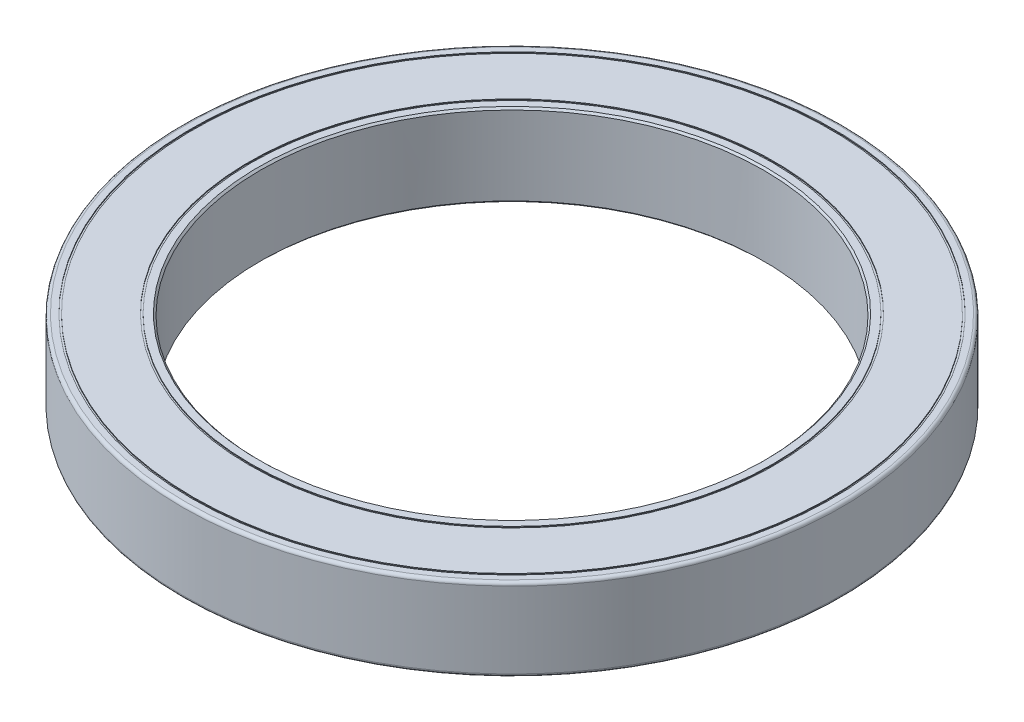
ISO-10303-21;
HEADER;
FILE_DESCRIPTION(('STEP AP214'),'2;1');
FILE_NAME('part.step','',(''),(''),'','','');
FILE_SCHEMA(('AUTOMOTIVE_DESIGN { 1 0 10303 214 1 1 1 1 }'));
ENDSEC;
DATA;
#1=APPLICATION_CONTEXT('core data for automotive mechanical design processes');
#2=APPLICATION_PROTOCOL_DEFINITION('international standard','automotive_design',2000,#1);
#3=PRODUCT_CONTEXT('',#1,'mechanical');
#4=PRODUCT('Part','Part','',(#3));
#5=PRODUCT_RELATED_PRODUCT_CATEGORY('part','',(#4));
#6=PRODUCT_DEFINITION_FORMATION('','',#4);
#7=PRODUCT_DEFINITION_CONTEXT('part definition',#1,'design');
#8=PRODUCT_DEFINITION('design','',#6,#7);
#9=PRODUCT_DEFINITION_SHAPE('','',#8);
#10=(LENGTH_UNIT() NAMED_UNIT(*) SI_UNIT(.MILLI.,.METRE.));
#11=(NAMED_UNIT(*) PLANE_ANGLE_UNIT() SI_UNIT($,.RADIAN.));
#12=(NAMED_UNIT(*) SI_UNIT($,.STERADIAN.) SOLID_ANGLE_UNIT());
#13=UNCERTAINTY_MEASURE_WITH_UNIT(LENGTH_MEASURE(1.E-05),#10,'distance_accuracy_value','');
#14=(GEOMETRIC_REPRESENTATION_CONTEXT(3) GLOBAL_UNCERTAINTY_ASSIGNED_CONTEXT((#13)) GLOBAL_UNIT_ASSIGNED_CONTEXT((#10,
#11,#12)) REPRESENTATION_CONTEXT('',''));
#15=CARTESIAN_POINT('',(0.,0.,0.));
#16=DIRECTION('',(0.,0.,1.));
#17=DIRECTION('',(1.,0.,0.));
#18=AXIS2_PLACEMENT_3D('',#15,#16,#17);
#19=CARTESIAN_POINT('',(36.,0.,0.));
#20=DIRECTION('',(0.,1.,0.));
#21=DIRECTION('',(0.,0.,1.));
#22=AXIS2_PLACEMENT_3D('',#19,#20,#21);
#23=PLANE('',#22);
#24=CARTESIAN_POINT('',(0.,0.,0.));
#25=DIRECTION('',(0.,1.,0.));
#26=DIRECTION('',(0.,0.,1.));
#27=AXIS2_PLACEMENT_3D('',#24,#25,#26);
#28=CIRCLE('',#27,35.656);
#29=CARTESIAN_POINT('',(0.,0.,35.656));
#30=VERTEX_POINT('',#29);
#31=EDGE_CURVE('E79',#30,#30,#28,.F.);
#32=ORIENTED_EDGE('',*,*,#31,.T.);
#33=EDGE_LOOP('',(#32));
#34=FACE_BOUND('',#33,.T.);
#35=CARTESIAN_POINT('',(0.,0.,0.));
#36=DIRECTION('',(0.,1.,0.));
#37=DIRECTION('',(0.,0.,1.));
#38=AXIS2_PLACEMENT_3D('',#35,#36,#37);
#39=CIRCLE('',#38,35.);
#40=CARTESIAN_POINT('',(0.,0.,35.));
#41=VERTEX_POINT('',#40);
#42=EDGE_CURVE('E91',#41,#41,#39,.T.);
#43=ORIENTED_EDGE('',*,*,#42,.T.);
#44=EDGE_LOOP('',(#43));
#45=FACE_BOUND('',#44,.T.);
#46=ADVANCED_FACE('F49',(#34,#45),#23,.F.);
#47=CARTESIAN_POINT('',(0.,4.5,0.));
#48=DIRECTION('',(0.,1.,0.));
#49=DIRECTION('',(0.,0.,1.));
#50=AXIS2_PLACEMENT_3D('',#47,#48,#49);
#51=CYLINDRICAL_SURFACE('',#50,35.);
#52=ORIENTED_EDGE('',*,*,#42,.F.);
#53=EDGE_LOOP('',(#52));
#54=FACE_BOUND('',#53,.T.);
#55=CARTESIAN_POINT('',(0.,0.1,0.));
#56=DIRECTION('',(0.,1.,0.));
#57=DIRECTION('',(0.,0.,1.));
#58=AXIS2_PLACEMENT_3D('',#55,#56,#57);
#59=CIRCLE('',#58,35.);
#60=CARTESIAN_POINT('',(0.,0.1,35.));
#61=VERTEX_POINT('',#60);
#62=EDGE_CURVE('E95',#61,#61,#59,.T.);
#63=ORIENTED_EDGE('',*,*,#62,.T.);
#64=EDGE_LOOP('',(#63));
#65=FACE_BOUND('',#64,.T.);
#66=ADVANCED_FACE('F173',(#54,#65),#51,.F.);
#67=CARTESIAN_POINT('',(35.,0.1,0.));
#68=DIRECTION('',(0.,1.,0.));
#69=DIRECTION('',(0.,0.,1.));
#70=AXIS2_PLACEMENT_3D('',#67,#68,#69);
#71=PLANE('',#70);
#72=ORIENTED_EDGE('',*,*,#62,.F.);
#73=EDGE_LOOP('',(#72));
#74=FACE_BOUND('',#73,.T.);
#75=CARTESIAN_POINT('',(0.,0.1,0.));
#76=DIRECTION('',(0.,1.,0.));
#77=DIRECTION('',(0.,0.,1.));
#78=AXIS2_PLACEMENT_3D('',#75,#76,#77);
#79=CIRCLE('',#78,34.8);
#80=CARTESIAN_POINT('',(0.,0.1,34.8));
#81=VERTEX_POINT('',#80);
#82=EDGE_CURVE('E99',#81,#81,#79,.T.);
#83=ORIENTED_EDGE('',*,*,#82,.T.);
#84=EDGE_LOOP('',(#83));
#85=FACE_BOUND('',#84,.T.);
#86=ADVANCED_FACE('F179',(#74,#85),#71,.F.);
#87=CARTESIAN_POINT('',(0.,4.5,0.));
#88=DIRECTION('',(0.,1.,0.));
#89=DIRECTION('',(0.,0.,1.));
#90=AXIS2_PLACEMENT_3D('',#87,#88,#89);
#91=CYLINDRICAL_SURFACE('',#90,34.8);
#92=ORIENTED_EDGE('',*,*,#82,.F.);
#93=EDGE_LOOP('',(#92));
#94=FACE_BOUND('',#93,.T.);
#95=CARTESIAN_POINT('',(0.,0.,0.));
#96=DIRECTION('',(0.,1.,0.));
#97=DIRECTION('',(0.,0.,1.));
#98=AXIS2_PLACEMENT_3D('',#95,#96,#97);
#99=CIRCLE('',#98,34.8);
#100=CARTESIAN_POINT('',(0.,0.,34.8));
#101=VERTEX_POINT('',#100);
#102=EDGE_CURVE('E103',#101,#101,#99,.T.);
#103=ORIENTED_EDGE('',*,*,#102,.T.);
#104=EDGE_LOOP('',(#103));
#105=FACE_BOUND('',#104,.T.);
#106=ADVANCED_FACE('F233',(#94,#105),#91,.T.);
#107=CARTESIAN_POINT('',(28.7,0.,0.));
#108=DIRECTION('',(0.,1.,0.));
#109=DIRECTION('',(0.,0.,1.));
#110=AXIS2_PLACEMENT_3D('',#107,#108,#109);
#111=PLANE('',#110);
#112=ORIENTED_EDGE('',*,*,#102,.F.);
#113=EDGE_LOOP('',(#112));
#114=FACE_BOUND('',#113,.T.);
#115=CARTESIAN_POINT('',(0.,0.,0.));
#116=DIRECTION('',(0.,1.,0.));
#117=DIRECTION('',(0.,0.,1.));
#118=AXIS2_PLACEMENT_3D('',#115,#116,#117);
#119=CIRCLE('',#118,28.7);
#120=CARTESIAN_POINT('',(0.,0.,28.7));
#121=VERTEX_POINT('',#120);
#122=EDGE_CURVE('E107',#121,#121,#119,.T.);
#123=ORIENTED_EDGE('',*,*,#122,.T.);
#124=EDGE_LOOP('',(#123));
#125=FACE_BOUND('',#124,.T.);
#126=ADVANCED_FACE('F229',(#114,#125),#111,.F.);
#127=CARTESIAN_POINT('',(0.,4.5,0.));
#128=DIRECTION('',(0.,1.,0.));
#129=DIRECTION('',(0.,0.,1.));
#130=AXIS2_PLACEMENT_3D('',#127,#128,#129);
#131=CYLINDRICAL_SURFACE('',#130,28.7);
#132=ORIENTED_EDGE('',*,*,#122,.F.);
#133=EDGE_LOOP('',(#132));
#134=FACE_BOUND('',#133,.T.);
#135=CARTESIAN_POINT('',(0.,0.1,0.));
#136=DIRECTION('',(0.,1.,0.));
#137=DIRECTION('',(0.,0.,1.));
#138=AXIS2_PLACEMENT_3D('',#135,#136,#137);
#139=CIRCLE('',#138,28.7);
#140=CARTESIAN_POINT('',(0.,0.1,28.7));
#141=VERTEX_POINT('',#140);
#142=EDGE_CURVE('E111',#141,#141,#139,.T.);
#143=ORIENTED_EDGE('',*,*,#142,.T.);
#144=EDGE_LOOP('',(#143));
#145=FACE_BOUND('',#144,.T.);
#146=ADVANCED_FACE('F221',(#134,#145),#131,.F.);
#147=CARTESIAN_POINT('',(28.5,0.1,0.));
#148=DIRECTION('',(0.,1.,0.));
#149=DIRECTION('',(0.,0.,1.));
#150=AXIS2_PLACEMENT_3D('',#147,#148,#149);
#151=PLANE('',#150);
#152=ORIENTED_EDGE('',*,*,#142,.F.);
#153=EDGE_LOOP('',(#152));
#154=FACE_BOUND('',#153,.T.);
#155=CARTESIAN_POINT('',(0.,0.1,0.));
#156=DIRECTION('',(0.,1.,0.));
#157=DIRECTION('',(0.,0.,1.));
#158=AXIS2_PLACEMENT_3D('',#155,#156,#157);
#159=CIRCLE('',#158,28.5);
#160=CARTESIAN_POINT('',(0.,0.1,28.5));
#161=VERTEX_POINT('',#160);
#162=EDGE_CURVE('E115',#161,#161,#159,.T.);
#163=ORIENTED_EDGE('',*,*,#162,.T.);
#164=EDGE_LOOP('',(#163));
#165=FACE_BOUND('',#164,.T.);
#166=ADVANCED_FACE('F213',(#154,#165),#151,.F.);
#167=CARTESIAN_POINT('',(0.,4.5,0.));
#168=DIRECTION('',(0.,1.,0.));
#169=DIRECTION('',(0.,0.,1.));
#170=AXIS2_PLACEMENT_3D('',#167,#168,#169);
#171=CYLINDRICAL_SURFACE('',#170,28.5);
#172=ORIENTED_EDGE('',*,*,#162,.F.);
#173=EDGE_LOOP('',(#172));
#174=FACE_BOUND('',#173,.T.);
#175=CARTESIAN_POINT('',(0.,0.,0.));
#176=DIRECTION('',(0.,1.,0.));
#177=DIRECTION('',(0.,0.,1.));
#178=AXIS2_PLACEMENT_3D('',#175,#176,#177);
#179=CIRCLE('',#178,28.5);
#180=CARTESIAN_POINT('',(0.,0.,28.5));
#181=VERTEX_POINT('',#180);
#182=EDGE_CURVE('E119',#181,#181,#179,.T.);
#183=ORIENTED_EDGE('',*,*,#182,.T.);
#184=EDGE_LOOP('',(#183));
#185=FACE_BOUND('',#184,.T.);
#186=ADVANCED_FACE('F208',(#174,#185),#171,.T.);
#187=CARTESIAN_POINT('',(27.5,0.,0.));
#188=DIRECTION('',(0.,1.,0.));
#189=DIRECTION('',(0.,0.,1.));
#190=AXIS2_PLACEMENT_3D('',#187,#188,#189);
#191=PLANE('',#190);
#192=CARTESIAN_POINT('',(0.,0.,0.));
#193=DIRECTION('',(0.,1.,0.));
#194=DIRECTION('',(0.,0.,1.));
#195=AXIS2_PLACEMENT_3D('',#192,#193,#194);
#196=CIRCLE('',#195,27.7);
#197=CARTESIAN_POINT('',(0.,0.,27.7));
#198=VERTEX_POINT('',#197);
#199=EDGE_CURVE('E70',#198,#198,#196,.T.);
#200=ORIENTED_EDGE('',*,*,#199,.T.);
#201=EDGE_LOOP('',(#200));
#202=FACE_BOUND('',#201,.T.);
#203=ORIENTED_EDGE('',*,*,#182,.F.);
#204=EDGE_LOOP('',(#203));
#205=FACE_BOUND('',#204,.T.);
#206=ADVANCED_FACE('F204',(#202,#205),#191,.F.);
#207=CARTESIAN_POINT('',(0.,4.5,0.));
#208=DIRECTION('',(0.,1.,0.));
#209=DIRECTION('',(0.,0.,1.));
#210=AXIS2_PLACEMENT_3D('',#207,#208,#209);
#211=CYLINDRICAL_SURFACE('',#210,27.5);
#212=CARTESIAN_POINT('',(0.,0.199999999999992,0.));
#213=DIRECTION('',(0.,1.,0.));
#214=DIRECTION('',(0.,0.,1.));
#215=AXIS2_PLACEMENT_3D('',#212,#213,#214);
#216=CIRCLE('',#215,27.5);
#217=CARTESIAN_POINT('',(0.,0.199999999999992,27.5));
#218=VERTEX_POINT('',#217);
#219=EDGE_CURVE('E58',#218,#218,#216,.F.);
#220=ORIENTED_EDGE('',*,*,#219,.T.);
#221=EDGE_LOOP('',(#220));
#222=FACE_BOUND('',#221,.T.);
#223=CARTESIAN_POINT('',(0.,8.79999999999999,0.));
#224=DIRECTION('',(0.,-1.,0.));
#225=DIRECTION('',(0.,0.,-1.));
#226=AXIS2_PLACEMENT_3D('',#223,#224,#225);
#227=CIRCLE('',#226,27.5);
#228=CARTESIAN_POINT('',(0.,8.79999999999999,-27.5));
#229=VERTEX_POINT('',#228);
#230=EDGE_CURVE('E64',#229,#229,#227,.F.);
#231=ORIENTED_EDGE('',*,*,#230,.T.);
#232=EDGE_LOOP('',(#231));
#233=FACE_BOUND('',#232,.T.);
#234=ADVANCED_FACE('F207',(#222,#233),#211,.F.);
#235=CARTESIAN_POINT('',(27.5,9.,0.));
#236=DIRECTION('',(0.,-1.,0.));
#237=DIRECTION('',(0.,0.,-1.));
#238=AXIS2_PLACEMENT_3D('',#235,#236,#237);
#239=PLANE('',#238);
#240=CARTESIAN_POINT('',(0.,9.,0.));
#241=DIRECTION('',(0.,-1.,0.));
#242=DIRECTION('',(0.,0.,-1.));
#243=AXIS2_PLACEMENT_3D('',#240,#241,#242);
#244=CIRCLE('',#243,27.7);
#245=CARTESIAN_POINT('',(0.,9.,-27.7));
#246=VERTEX_POINT('',#245);
#247=EDGE_CURVE('E10',#246,#246,#244,.T.);
#248=ORIENTED_EDGE('',*,*,#247,.T.);
#249=EDGE_LOOP('',(#248));
#250=FACE_BOUND('',#249,.T.);
#251=CARTESIAN_POINT('',(0.,9.,0.));
#252=DIRECTION('',(0.,1.,0.));
#253=DIRECTION('',(0.,0.,1.));
#254=AXIS2_PLACEMENT_3D('',#251,#252,#253);
#255=CIRCLE('',#254,28.5);
#256=CARTESIAN_POINT('',(0.,9.,28.5));
#257=VERTEX_POINT('',#256);
#258=EDGE_CURVE('E122',#257,#257,#255,.T.);
#259=ORIENTED_EDGE('',*,*,#258,.T.);
#260=EDGE_LOOP('',(#259));
#261=FACE_BOUND('',#260,.T.);
#262=ADVANCED_FACE('F254',(#250,#261),#239,.F.);
#263=CARTESIAN_POINT('',(0.,4.5,0.));
#264=DIRECTION('',(0.,1.,0.));
#265=DIRECTION('',(0.,0.,1.));
#266=AXIS2_PLACEMENT_3D('',#263,#264,#265);
#267=CYLINDRICAL_SURFACE('',#266,28.5);
#268=ORIENTED_EDGE('',*,*,#258,.F.);
#269=EDGE_LOOP('',(#268));
#270=FACE_BOUND('',#269,.T.);
#271=CARTESIAN_POINT('',(0.,8.9,0.));
#272=DIRECTION('',(0.,1.,0.));
#273=DIRECTION('',(0.,0.,1.));
#274=AXIS2_PLACEMENT_3D('',#271,#272,#273);
#275=CIRCLE('',#274,28.5);
#276=CARTESIAN_POINT('',(0.,8.9,28.5));
#277=VERTEX_POINT('',#276);
#278=EDGE_CURVE('E126',#277,#277,#275,.T.);
#279=ORIENTED_EDGE('',*,*,#278,.T.);
#280=EDGE_LOOP('',(#279));
#281=FACE_BOUND('',#280,.T.);
#282=ADVANCED_FACE('F286',(#270,#281),#267,.T.);
#283=CARTESIAN_POINT('',(28.5,8.9,0.));
#284=DIRECTION('',(0.,-1.,0.));
#285=DIRECTION('',(0.,0.,-1.));
#286=AXIS2_PLACEMENT_3D('',#283,#284,#285);
#287=PLANE('',#286);
#288=ORIENTED_EDGE('',*,*,#278,.F.);
#289=EDGE_LOOP('',(#288));
#290=FACE_BOUND('',#289,.T.);
#291=CARTESIAN_POINT('',(0.,8.9,0.));
#292=DIRECTION('',(0.,1.,0.));
#293=DIRECTION('',(0.,0.,1.));
#294=AXIS2_PLACEMENT_3D('',#291,#292,#293);
#295=CIRCLE('',#294,28.7);
#296=CARTESIAN_POINT('',(0.,8.9,28.7));
#297=VERTEX_POINT('',#296);
#298=EDGE_CURVE('E130',#297,#297,#295,.T.);
#299=ORIENTED_EDGE('',*,*,#298,.T.);
#300=EDGE_LOOP('',(#299));
#301=FACE_BOUND('',#300,.T.);
#302=ADVANCED_FACE('F297',(#290,#301),#287,.F.);
#303=CARTESIAN_POINT('',(0.,4.5,0.));
#304=DIRECTION('',(0.,1.,0.));
#305=DIRECTION('',(0.,0.,1.));
#306=AXIS2_PLACEMENT_3D('',#303,#304,#305);
#307=CYLINDRICAL_SURFACE('',#306,28.7);
#308=ORIENTED_EDGE('',*,*,#298,.F.);
#309=EDGE_LOOP('',(#308));
#310=FACE_BOUND('',#309,.T.);
#311=CARTESIAN_POINT('',(0.,9.,0.));
#312=DIRECTION('',(0.,1.,0.));
#313=DIRECTION('',(0.,0.,1.));
#314=AXIS2_PLACEMENT_3D('',#311,#312,#313);
#315=CIRCLE('',#314,28.7);
#316=CARTESIAN_POINT('',(0.,9.,28.7));
#317=VERTEX_POINT('',#316);
#318=EDGE_CURVE('E134',#317,#317,#315,.T.);
#319=ORIENTED_EDGE('',*,*,#318,.T.);
#320=EDGE_LOOP('',(#319));
#321=FACE_BOUND('',#320,.T.);
#322=ADVANCED_FACE('F307',(#310,#321),#307,.F.);
#323=CARTESIAN_POINT('',(28.7,9.,0.));
#324=DIRECTION('',(0.,-1.,0.));
#325=DIRECTION('',(0.,0.,-1.));
#326=AXIS2_PLACEMENT_3D('',#323,#324,#325);
#327=PLANE('',#326);
#328=ORIENTED_EDGE('',*,*,#318,.F.);
#329=EDGE_LOOP('',(#328));
#330=FACE_BOUND('',#329,.T.);
#331=CARTESIAN_POINT('',(0.,9.,0.));
#332=DIRECTION('',(0.,1.,0.));
#333=DIRECTION('',(0.,0.,1.));
#334=AXIS2_PLACEMENT_3D('',#331,#332,#333);
#335=CIRCLE('',#334,34.8);
#336=CARTESIAN_POINT('',(0.,9.,34.8));
#337=VERTEX_POINT('',#336);
#338=EDGE_CURVE('E138',#337,#337,#335,.T.);
#339=ORIENTED_EDGE('',*,*,#338,.T.);
#340=EDGE_LOOP('',(#339));
#341=FACE_BOUND('',#340,.T.);
#342=ADVANCED_FACE('F317',(#330,#341),#327,.F.);
#343=CARTESIAN_POINT('',(0.,4.5,0.));
#344=DIRECTION('',(0.,1.,0.));
#345=DIRECTION('',(0.,0.,1.));
#346=AXIS2_PLACEMENT_3D('',#343,#344,#345);
#347=CYLINDRICAL_SURFACE('',#346,34.8);
#348=ORIENTED_EDGE('',*,*,#338,.F.);
#349=EDGE_LOOP('',(#348));
#350=FACE_BOUND('',#349,.T.);
#351=CARTESIAN_POINT('',(0.,8.9,0.));
#352=DIRECTION('',(0.,1.,0.));
#353=DIRECTION('',(0.,0.,1.));
#354=AXIS2_PLACEMENT_3D('',#351,#352,#353);
#355=CIRCLE('',#354,34.8);
#356=CARTESIAN_POINT('',(0.,8.9,34.8));
#357=VERTEX_POINT('',#356);
#358=EDGE_CURVE('E142',#357,#357,#355,.T.);
#359=ORIENTED_EDGE('',*,*,#358,.T.);
#360=EDGE_LOOP('',(#359));
#361=FACE_BOUND('',#360,.T.);
#362=ADVANCED_FACE('F328',(#350,#361),#347,.T.);
#363=CARTESIAN_POINT('',(35.,8.9,0.));
#364=DIRECTION('',(0.,-1.,0.));
#365=DIRECTION('',(0.,0.,-1.));
#366=AXIS2_PLACEMENT_3D('',#363,#364,#365);
#367=PLANE('',#366);
#368=ORIENTED_EDGE('',*,*,#358,.F.);
#369=EDGE_LOOP('',(#368));
#370=FACE_BOUND('',#369,.T.);
#371=CARTESIAN_POINT('',(0.,8.9,0.));
#372=DIRECTION('',(0.,1.,0.));
#373=DIRECTION('',(0.,0.,1.));
#374=AXIS2_PLACEMENT_3D('',#371,#372,#373);
#375=CIRCLE('',#374,35.);
#376=CARTESIAN_POINT('',(0.,8.9,35.));
#377=VERTEX_POINT('',#376);
#378=EDGE_CURVE('E146',#377,#377,#375,.T.);
#379=ORIENTED_EDGE('',*,*,#378,.T.);
#380=EDGE_LOOP('',(#379));
#381=FACE_BOUND('',#380,.T.);
#382=ADVANCED_FACE('F169',(#370,#381),#367,.F.);
#383=CARTESIAN_POINT('',(0.,4.5,0.));
#384=DIRECTION('',(0.,1.,0.));
#385=DIRECTION('',(0.,0.,1.));
#386=AXIS2_PLACEMENT_3D('',#383,#384,#385);
#387=CYLINDRICAL_SURFACE('',#386,35.);
#388=ORIENTED_EDGE('',*,*,#378,.F.);
#389=EDGE_LOOP('',(#388));
#390=FACE_BOUND('',#389,.T.);
#391=CARTESIAN_POINT('',(0.,9.,0.));
#392=DIRECTION('',(0.,1.,0.));
#393=DIRECTION('',(0.,0.,1.));
#394=AXIS2_PLACEMENT_3D('',#391,#392,#393);
#395=CIRCLE('',#394,35.);
#396=CARTESIAN_POINT('',(0.,9.,35.));
#397=VERTEX_POINT('',#396);
#398=EDGE_CURVE('E150',#397,#397,#395,.T.);
#399=ORIENTED_EDGE('',*,*,#398,.T.);
#400=EDGE_LOOP('',(#399));
#401=FACE_BOUND('',#400,.T.);
#402=ADVANCED_FACE('F155',(#390,#401),#387,.F.);
#403=CARTESIAN_POINT('',(36.,9.,0.));
#404=DIRECTION('',(0.,-1.,0.));
#405=DIRECTION('',(0.,0.,-1.));
#406=AXIS2_PLACEMENT_3D('',#403,#404,#405);
#407=PLANE('',#406);
#408=CARTESIAN_POINT('',(0.,9.,0.));
#409=DIRECTION('',(0.,-1.,0.));
#410=DIRECTION('',(0.,0.,-1.));
#411=AXIS2_PLACEMENT_3D('',#408,#409,#410);
#412=CIRCLE('',#411,35.656);
#413=CARTESIAN_POINT('',(0.,9.,-35.656));
#414=VERTEX_POINT('',#413);
#415=EDGE_CURVE('E75',#414,#414,#412,.F.);
#416=ORIENTED_EDGE('',*,*,#415,.T.);
#417=EDGE_LOOP('',(#416));
#418=FACE_BOUND('',#417,.T.);
#419=ORIENTED_EDGE('',*,*,#398,.F.);
#420=EDGE_LOOP('',(#419));
#421=FACE_BOUND('',#420,.T.);
#422=ADVANCED_FACE('F157',(#418,#421),#407,.F.);
#423=CARTESIAN_POINT('',(0.,4.5,0.));
#424=DIRECTION('',(0.,1.,0.));
#425=DIRECTION('',(0.,0.,1.));
#426=AXIS2_PLACEMENT_3D('',#423,#424,#425);
#427=CYLINDRICAL_SURFACE('',#426,36.);
#428=CARTESIAN_POINT('',(0.,0.344,0.));
#429=DIRECTION('',(0.,1.,0.));
#430=DIRECTION('',(0.,0.,1.));
#431=AXIS2_PLACEMENT_3D('',#428,#429,#430);
#432=CIRCLE('',#431,36.);
#433=CARTESIAN_POINT('',(0.,0.344,36.));
#434=VERTEX_POINT('',#433);
#435=EDGE_CURVE('E83',#434,#434,#432,.T.);
#436=ORIENTED_EDGE('',*,*,#435,.T.);
#437=EDGE_LOOP('',(#436));
#438=FACE_BOUND('',#437,.T.);
#439=CARTESIAN_POINT('',(0.,8.656,0.));
#440=DIRECTION('',(0.,-1.,0.));
#441=DIRECTION('',(0.,0.,-1.));
#442=AXIS2_PLACEMENT_3D('',#439,#440,#441);
#443=CIRCLE('',#442,36.);
#444=CARTESIAN_POINT('',(0.,8.656,-36.));
#445=VERTEX_POINT('',#444);
#446=EDGE_CURVE('E87',#445,#445,#443,.T.);
#447=ORIENTED_EDGE('',*,*,#446,.T.);
#448=EDGE_LOOP('',(#447));
#449=FACE_BOUND('',#448,.T.);
#450=ADVANCED_FACE('F159',(#438,#449),#427,.T.);
#451=CARTESIAN_POINT('',(0.,0.344,0.));
#452=DIRECTION('',(0.,1.,0.));
#453=DIRECTION('',(0.,0.,1.));
#454=AXIS2_PLACEMENT_3D('',#451,#452,#453);
#455=TOROIDAL_SURFACE('',#454,35.656,0.344);
#456=ORIENTED_EDGE('',*,*,#31,.F.);
#457=EDGE_LOOP('',(#456));
#458=FACE_BOUND('',#457,.T.);
#459=ORIENTED_EDGE('',*,*,#435,.F.);
#460=EDGE_LOOP('',(#459));
#461=FACE_BOUND('',#460,.T.);
#462=ADVANCED_FACE('F165',(#458,#461),#455,.T.);
#463=CARTESIAN_POINT('',(0.,8.656,0.));
#464=DIRECTION('',(0.,-1.,0.));
#465=DIRECTION('',(0.,0.,-1.));
#466=AXIS2_PLACEMENT_3D('',#463,#464,#465);
#467=TOROIDAL_SURFACE('',#466,35.656,0.344);
#468=ORIENTED_EDGE('',*,*,#446,.F.);
#469=EDGE_LOOP('',(#468));
#470=FACE_BOUND('',#469,.T.);
#471=ORIENTED_EDGE('',*,*,#415,.F.);
#472=EDGE_LOOP('',(#471));
#473=FACE_BOUND('',#472,.T.);
#474=ADVANCED_FACE('F186',(#470,#473),#467,.T.);
#475=CARTESIAN_POINT('',(0.,0.,0.));
#476=DIRECTION('',(0.,-1.,0.));
#477=DIRECTION('',(0.,0.,-1.));
#478=AXIS2_PLACEMENT_3D('',#475,#476,#477);
#479=CONICAL_SURFACE('',#478,27.7,0.78539816339744);
#480=ORIENTED_EDGE('',*,*,#219,.F.);
#481=EDGE_LOOP('',(#480));
#482=FACE_BOUND('',#481,.T.);
#483=ORIENTED_EDGE('',*,*,#199,.F.);
#484=EDGE_LOOP('',(#483));
#485=FACE_BOUND('',#484,.T.);
#486=ADVANCED_FACE('F189',(#482,#485),#479,.F.);
#487=CARTESIAN_POINT('',(0.,8.79999999999999,0.));
#488=DIRECTION('',(0.,1.,0.));
#489=DIRECTION('',(0.,0.,1.));
#490=AXIS2_PLACEMENT_3D('',#487,#488,#489);
#491=CONICAL_SURFACE('',#490,27.5,0.78539816339744);
#492=ORIENTED_EDGE('',*,*,#247,.F.);
#493=EDGE_LOOP('',(#492));
#494=FACE_BOUND('',#493,.T.);
#495=ORIENTED_EDGE('',*,*,#230,.F.);
#496=EDGE_LOOP('',(#495));
#497=FACE_BOUND('',#496,.T.);
#498=ADVANCED_FACE('F52',(#494,#497),#491,.F.);
#499=CLOSED_SHELL('',(#46,#66,#86,#106,#126,#146,#166,#186,#206,#234,#262,#282,#302,#322,#342,
#362,#382,#402,#422,#450,#462,#474,#486,#498));
#500=MANIFOLD_SOLID_BREP('B2',#499);
#501=ADVANCED_BREP_SHAPE_REPRESENTATION('',(#18,#500),#14);
#502=SHAPE_DEFINITION_REPRESENTATION(#9,#501);
ENDSEC;
END-ISO-10303-21;
